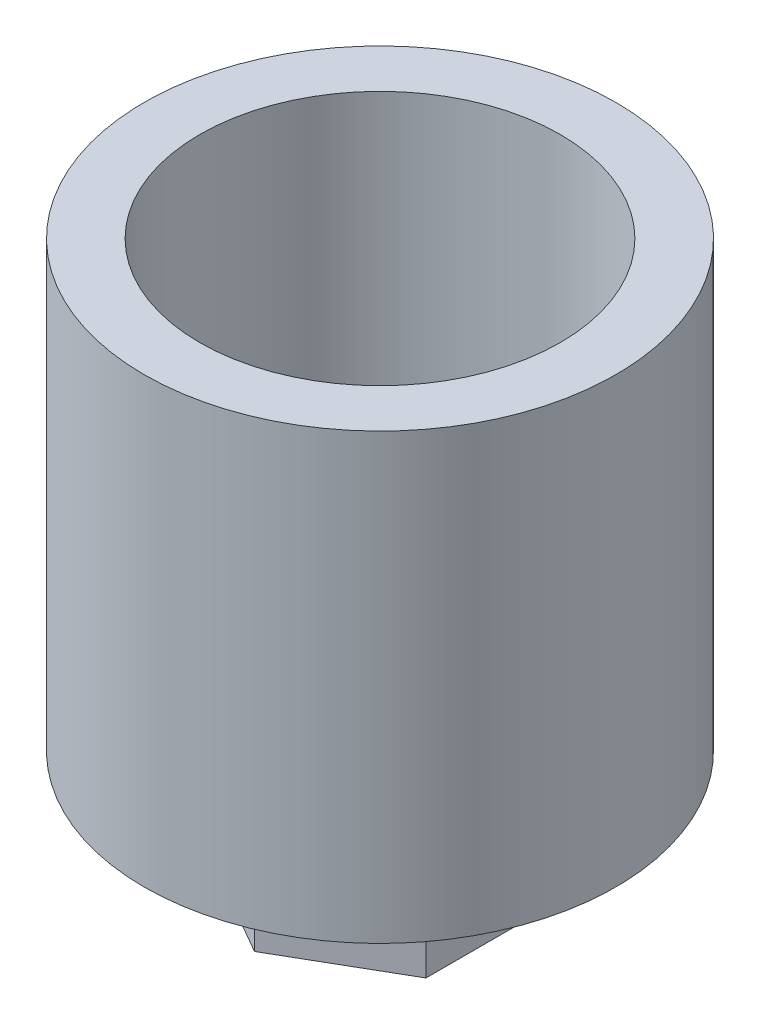
ISO-10303-21;
HEADER;
FILE_DESCRIPTION(('STEP AP214'),'2;1');
FILE_NAME('part.step','',(''),(''),'','','');
FILE_SCHEMA(('AUTOMOTIVE_DESIGN { 1 0 10303 214 1 1 1 1 }'));
ENDSEC;
DATA;
#1=APPLICATION_CONTEXT('core data for automotive mechanical design processes');
#2=APPLICATION_PROTOCOL_DEFINITION('international standard','automotive_design',2000,#1);
#3=PRODUCT_CONTEXT('',#1,'mechanical');
#4=PRODUCT('Part','Part','',(#3));
#5=PRODUCT_RELATED_PRODUCT_CATEGORY('part','',(#4));
#6=PRODUCT_DEFINITION_FORMATION('','',#4);
#7=PRODUCT_DEFINITION_CONTEXT('part definition',#1,'design');
#8=PRODUCT_DEFINITION('design','',#6,#7);
#9=PRODUCT_DEFINITION_SHAPE('','',#8);
#10=(LENGTH_UNIT() NAMED_UNIT(*) SI_UNIT(.MILLI.,.METRE.));
#11=(NAMED_UNIT(*) PLANE_ANGLE_UNIT() SI_UNIT($,.RADIAN.));
#12=(NAMED_UNIT(*) SI_UNIT($,.STERADIAN.) SOLID_ANGLE_UNIT());
#13=UNCERTAINTY_MEASURE_WITH_UNIT(LENGTH_MEASURE(1.E-05),#10,'distance_accuracy_value','');
#14=(GEOMETRIC_REPRESENTATION_CONTEXT(3) GLOBAL_UNCERTAINTY_ASSIGNED_CONTEXT((#13)) GLOBAL_UNIT_ASSIGNED_CONTEXT((#10,
#11,#12)) REPRESENTATION_CONTEXT('',''));
#15=CARTESIAN_POINT('',(0.,0.,0.));
#16=DIRECTION('',(0.,0.,1.));
#17=DIRECTION('',(1.,0.,0.));
#18=AXIS2_PLACEMENT_3D('',#15,#16,#17);
#19=CARTESIAN_POINT('',(0.,0.,0.));
#20=DIRECTION('',(0.,1.,0.));
#21=DIRECTION('',(0.,0.,1.));
#22=AXIS2_PLACEMENT_3D('',#19,#20,#21);
#23=PLANE('',#22);
#24=CARTESIAN_POINT('',(0.,0.,0.));
#25=DIRECTION('',(0.,1.,0.));
#26=DIRECTION('',(0.,0.,1.));
#27=AXIS2_PLACEMENT_3D('',#24,#25,#26);
#28=CIRCLE('',#27,13.5);
#29=CARTESIAN_POINT('',(0.,0.,13.5));
#30=VERTEX_POINT('',#29);
#31=EDGE_CURVE('E41',#30,#30,#28,.T.);
#32=ORIENTED_EDGE('',*,*,#31,.F.);
#33=EDGE_LOOP('',(#32));
#34=FACE_BOUND('',#33,.T.);
#35=DIRECTION('',(0.,0.,1.));
#36=VECTOR('',#35,1.);
#37=CARTESIAN_POINT('',(6.223,0.,-3.59285072516704));
#38=LINE('',#37,#36);
#39=CARTESIAN_POINT('',(6.223,0.,-3.59285072516704));
#40=VERTEX_POINT('',#39);
#41=CARTESIAN_POINT('',(6.223,0.,3.59285072516704));
#42=VERTEX_POINT('',#41);
#43=EDGE_CURVE('E52',#40,#42,#38,.T.);
#44=ORIENTED_EDGE('',*,*,#43,.F.);
#45=DIRECTION('',(0.866025403784439,0.,0.5));
#46=VECTOR('',#45,1.);
#47=CARTESIAN_POINT('',(0.,0.,-7.18570145033408));
#48=LINE('',#47,#46);
#49=CARTESIAN_POINT('',(0.,0.,-7.18570145033408));
#50=VERTEX_POINT('',#49);
#51=EDGE_CURVE('E56',#50,#40,#48,.T.);
#52=ORIENTED_EDGE('',*,*,#51,.F.);
#53=DIRECTION('',(0.866025403784439,0.,-0.5));
#54=VECTOR('',#53,1.);
#55=CARTESIAN_POINT('',(-6.223,0.,-3.59285072516704));
#56=LINE('',#55,#54);
#57=CARTESIAN_POINT('',(-6.223,0.,-3.59285072516704));
#58=VERTEX_POINT('',#57);
#59=EDGE_CURVE('E252',#58,#50,#56,.T.);
#60=ORIENTED_EDGE('',*,*,#59,.F.);
#61=DIRECTION('',(0.,0.,-1.));
#62=VECTOR('',#61,1.);
#63=CARTESIAN_POINT('',(-6.223,0.,3.59285072516704));
#64=LINE('',#63,#62);
#65=CARTESIAN_POINT('',(-6.223,0.,3.59285072516704));
#66=VERTEX_POINT('',#65);
#67=EDGE_CURVE('E267',#66,#58,#64,.T.);
#68=ORIENTED_EDGE('',*,*,#67,.F.);
#69=DIRECTION('',(-0.866025403784439,0.,-0.5));
#70=VECTOR('',#69,1.);
#71=CARTESIAN_POINT('',(0.,0.,7.18570145033408));
#72=LINE('',#71,#70);
#73=CARTESIAN_POINT('',(0.,0.,7.18570145033408));
#74=VERTEX_POINT('',#73);
#75=EDGE_CURVE('E270',#74,#66,#72,.T.);
#76=ORIENTED_EDGE('',*,*,#75,.F.);
#77=DIRECTION('',(-0.866025403784439,0.,0.5));
#78=VECTOR('',#77,1.);
#79=CARTESIAN_POINT('',(6.223,0.,3.59285072516704));
#80=LINE('',#79,#78);
#81=EDGE_CURVE('E271',#42,#74,#80,.T.);
#82=ORIENTED_EDGE('',*,*,#81,.F.);
#83=EDGE_LOOP('',(#44,#52,#60,#68,#76,#82));
#84=FACE_BOUND('',#83,.T.);
#85=ADVANCED_FACE('F37',(#34,#84),#23,.F.);
#86=CARTESIAN_POINT('',(0.,25.4,0.));
#87=DIRECTION('',(0.,-1.,0.));
#88=DIRECTION('',(0.,0.,-1.));
#89=AXIS2_PLACEMENT_3D('',#86,#87,#88);
#90=CYLINDRICAL_SURFACE('',#89,13.5);
#91=CARTESIAN_POINT('',(0.,25.4,0.));
#92=DIRECTION('',(0.,1.,0.));
#93=DIRECTION('',(0.,0.,1.));
#94=AXIS2_PLACEMENT_3D('',#91,#92,#93);
#95=CIRCLE('',#94,13.5);
#96=CARTESIAN_POINT('',(0.,25.4,13.5));
#97=VERTEX_POINT('',#96);
#98=EDGE_CURVE('E11',#97,#97,#95,.T.);
#99=ORIENTED_EDGE('',*,*,#98,.F.);
#100=EDGE_LOOP('',(#99));
#101=FACE_BOUND('',#100,.T.);
#102=ORIENTED_EDGE('',*,*,#31,.T.);
#103=EDGE_LOOP('',(#102));
#104=FACE_BOUND('',#103,.T.);
#105=ADVANCED_FACE('F39',(#101,#104),#90,.T.);
#106=CARTESIAN_POINT('',(0.,25.4,0.));
#107=DIRECTION('',(0.,1.,0.));
#108=DIRECTION('',(0.,0.,1.));
#109=AXIS2_PLACEMENT_3D('',#106,#107,#108);
#110=PLANE('',#109);
#111=CARTESIAN_POINT('',(0.,25.4,0.));
#112=DIRECTION('',(0.,1.,0.));
#113=DIRECTION('',(0.,0.,1.));
#114=AXIS2_PLACEMENT_3D('',#111,#112,#113);
#115=CIRCLE('',#114,10.31875);
#116=CARTESIAN_POINT('',(0.,25.4,10.31875));
#117=VERTEX_POINT('',#116);
#118=EDGE_CURVE('E113',#117,#117,#115,.T.);
#119=ORIENTED_EDGE('',*,*,#118,.F.);
#120=EDGE_LOOP('',(#119));
#121=FACE_BOUND('',#120,.T.);
#122=ORIENTED_EDGE('',*,*,#98,.T.);
#123=EDGE_LOOP('',(#122));
#124=FACE_BOUND('',#123,.T.);
#125=ADVANCED_FACE('F135',(#121,#124),#110,.T.);
#126=CARTESIAN_POINT('',(0.,6.35,0.));
#127=DIRECTION('',(0.,1.,0.));
#128=DIRECTION('',(0.,0.,1.));
#129=AXIS2_PLACEMENT_3D('',#126,#127,#128);
#130=CONICAL_SURFACE('',#129,10.31875,1.02974425867665);
#131=CARTESIAN_POINT('',(0.,0.14986948740936,0.));
#132=VERTEX_POINT('',#131);
#133=VERTEX_LOOP('',#132);
#134=FACE_BOUND('',#133,.T.);
#135=CARTESIAN_POINT('',(0.,6.35,0.));
#136=DIRECTION('',(0.,1.,0.));
#137=DIRECTION('',(0.,0.,1.));
#138=AXIS2_PLACEMENT_3D('',#135,#136,#137);
#139=CIRCLE('',#138,10.31875);
#140=CARTESIAN_POINT('',(0.,6.35,10.31875));
#141=VERTEX_POINT('',#140);
#142=EDGE_CURVE('E116',#141,#141,#139,.T.);
#143=ORIENTED_EDGE('',*,*,#142,.T.);
#144=EDGE_LOOP('',(#143));
#145=FACE_BOUND('',#144,.T.);
#146=ADVANCED_FACE('F140',(#134,#145),#130,.F.);
#147=CARTESIAN_POINT('',(0.,25.4,0.));
#148=DIRECTION('',(0.,1.,0.));
#149=DIRECTION('',(0.,0.,1.));
#150=AXIS2_PLACEMENT_3D('',#147,#148,#149);
#151=CYLINDRICAL_SURFACE('',#150,10.31875);
#152=ORIENTED_EDGE('',*,*,#142,.F.);
#153=EDGE_LOOP('',(#152));
#154=FACE_BOUND('',#153,.T.);
#155=ORIENTED_EDGE('',*,*,#118,.T.);
#156=EDGE_LOOP('',(#155));
#157=FACE_BOUND('',#156,.T.);
#158=ADVANCED_FACE('F144',(#154,#157),#151,.F.);
#159=CARTESIAN_POINT('',(6.223,-6.35,-3.59285072516704));
#160=DIRECTION('',(-1.,0.,0.));
#161=DIRECTION('',(0.,0.,1.));
#162=AXIS2_PLACEMENT_3D('',#159,#160,#161);
#163=PLANE('',#162);
#164=ORIENTED_EDGE('',*,*,#43,.T.);
#165=DIRECTION('',(0.,1.,0.));
#166=VECTOR('',#165,1.);
#167=CARTESIAN_POINT('',(6.223,-6.35,3.59285072516704));
#168=LINE('',#167,#166);
#169=CARTESIAN_POINT('',(6.223,-6.35,3.59285072516704));
#170=VERTEX_POINT('',#169);
#171=EDGE_CURVE('E96',#170,#42,#168,.T.);
#172=ORIENTED_EDGE('',*,*,#171,.F.);
#173=DIRECTION('',(0.,0.,1.));
#174=VECTOR('',#173,1.);
#175=CARTESIAN_POINT('',(6.223,-6.35,-3.59285072516704));
#176=LINE('',#175,#174);
#177=CARTESIAN_POINT('',(6.223,-6.35,-3.59285072516704));
#178=VERTEX_POINT('',#177);
#179=EDGE_CURVE('E102',#178,#170,#176,.T.);
#180=ORIENTED_EDGE('',*,*,#179,.F.);
#181=DIRECTION('',(0.,1.,0.));
#182=VECTOR('',#181,1.);
#183=CARTESIAN_POINT('',(6.223,-6.35,-3.59285072516704));
#184=LINE('',#183,#182);
#185=EDGE_CURVE('E249',#178,#40,#184,.T.);
#186=ORIENTED_EDGE('',*,*,#185,.T.);
#187=EDGE_LOOP('',(#164,#172,#180,#186));
#188=FACE_BOUND('',#187,.T.);
#189=ADVANCED_FACE('F112',(#188),#163,.F.);
#190=CARTESIAN_POINT('',(6.223,-6.35,3.59285072516704));
#191=DIRECTION('',(-0.5,0.,-0.866025403784439));
#192=DIRECTION('',(-0.866025403784439,0.,0.5));
#193=AXIS2_PLACEMENT_3D('',#190,#191,#192);
#194=PLANE('',#193);
#195=ORIENTED_EDGE('',*,*,#81,.T.);
#196=DIRECTION('',(0.,1.,0.));
#197=VECTOR('',#196,1.);
#198=CARTESIAN_POINT('',(0.,-6.35,7.18570145033408));
#199=LINE('',#198,#197);
#200=CARTESIAN_POINT('',(0.,-6.35,7.18570145033408));
#201=VERTEX_POINT('',#200);
#202=EDGE_CURVE('E98',#201,#74,#199,.T.);
#203=ORIENTED_EDGE('',*,*,#202,.F.);
#204=DIRECTION('',(-0.866025403784439,0.,0.5));
#205=VECTOR('',#204,1.);
#206=CARTESIAN_POINT('',(6.223,-6.35,3.59285072516704));
#207=LINE('',#206,#205);
#208=EDGE_CURVE('E91',#170,#201,#207,.T.);
#209=ORIENTED_EDGE('',*,*,#208,.F.);
#210=ORIENTED_EDGE('',*,*,#171,.T.);
#211=EDGE_LOOP('',(#195,#203,#209,#210));
#212=FACE_BOUND('',#211,.T.);
#213=ADVANCED_FACE('F94',(#212),#194,.F.);
#214=CARTESIAN_POINT('',(0.,-6.35,7.18570145033408));
#215=DIRECTION('',(0.5,0.,-0.866025403784439));
#216=DIRECTION('',(-0.866025403784439,0.,-0.5));
#217=AXIS2_PLACEMENT_3D('',#214,#215,#216);
#218=PLANE('',#217);
#219=ORIENTED_EDGE('',*,*,#75,.T.);
#220=DIRECTION('',(0.,1.,0.));
#221=VECTOR('',#220,1.);
#222=CARTESIAN_POINT('',(-6.223,-6.35,3.59285072516704));
#223=LINE('',#222,#221);
#224=CARTESIAN_POINT('',(-6.223,-6.35,3.59285072516704));
#225=VERTEX_POINT('',#224);
#226=EDGE_CURVE('E118',#225,#66,#223,.T.);
#227=ORIENTED_EDGE('',*,*,#226,.F.);
#228=DIRECTION('',(-0.866025403784439,0.,-0.5));
#229=VECTOR('',#228,1.);
#230=CARTESIAN_POINT('',(0.,-6.35,7.18570145033408));
#231=LINE('',#230,#229);
#232=EDGE_CURVE('E101',#201,#225,#231,.T.);
#233=ORIENTED_EDGE('',*,*,#232,.F.);
#234=ORIENTED_EDGE('',*,*,#202,.T.);
#235=EDGE_LOOP('',(#219,#227,#233,#234));
#236=FACE_BOUND('',#235,.T.);
#237=ADVANCED_FACE('F153',(#236),#218,.F.);
#238=CARTESIAN_POINT('',(-6.223,-6.35,3.59285072516704));
#239=DIRECTION('',(1.,0.,0.));
#240=DIRECTION('',(0.,0.,-1.));
#241=AXIS2_PLACEMENT_3D('',#238,#239,#240);
#242=PLANE('',#241);
#243=ORIENTED_EDGE('',*,*,#67,.T.);
#244=DIRECTION('',(0.,1.,0.));
#245=VECTOR('',#244,1.);
#246=CARTESIAN_POINT('',(-6.223,-6.35,-3.59285072516704));
#247=LINE('',#246,#245);
#248=CARTESIAN_POINT('',(-6.223,-6.35,-3.59285072516704));
#249=VERTEX_POINT('',#248);
#250=EDGE_CURVE('E255',#249,#58,#247,.T.);
#251=ORIENTED_EDGE('',*,*,#250,.F.);
#252=DIRECTION('',(0.,0.,-1.));
#253=VECTOR('',#252,1.);
#254=CARTESIAN_POINT('',(-6.223,-6.35,3.59285072516704));
#255=LINE('',#254,#253);
#256=EDGE_CURVE('E268',#225,#249,#255,.T.);
#257=ORIENTED_EDGE('',*,*,#256,.F.);
#258=ORIENTED_EDGE('',*,*,#226,.T.);
#259=EDGE_LOOP('',(#243,#251,#257,#258));
#260=FACE_BOUND('',#259,.T.);
#261=ADVANCED_FACE('F156',(#260),#242,.F.);
#262=CARTESIAN_POINT('',(-6.223,-6.35,-3.59285072516704));
#263=DIRECTION('',(0.5,0.,0.866025403784439));
#264=DIRECTION('',(0.866025403784439,0.,-0.5));
#265=AXIS2_PLACEMENT_3D('',#262,#263,#264);
#266=PLANE('',#265);
#267=ORIENTED_EDGE('',*,*,#59,.T.);
#268=DIRECTION('',(0.,1.,0.));
#269=VECTOR('',#268,1.);
#270=CARTESIAN_POINT('',(0.,-6.35,-7.18570145033408));
#271=LINE('',#270,#269);
#272=CARTESIAN_POINT('',(0.,-6.35,-7.18570145033408));
#273=VERTEX_POINT('',#272);
#274=EDGE_CURVE('E251',#273,#50,#271,.T.);
#275=ORIENTED_EDGE('',*,*,#274,.F.);
#276=DIRECTION('',(0.866025403784439,0.,-0.5));
#277=VECTOR('',#276,1.);
#278=CARTESIAN_POINT('',(-6.223,-6.35,-3.59285072516704));
#279=LINE('',#278,#277);
#280=EDGE_CURVE('E257',#249,#273,#279,.T.);
#281=ORIENTED_EDGE('',*,*,#280,.F.);
#282=ORIENTED_EDGE('',*,*,#250,.T.);
#283=EDGE_LOOP('',(#267,#275,#281,#282));
#284=FACE_BOUND('',#283,.T.);
#285=ADVANCED_FACE('F160',(#284),#266,.F.);
#286=CARTESIAN_POINT('',(0.,-6.35,-7.18570145033408));
#287=DIRECTION('',(-0.5,0.,0.866025403784439));
#288=DIRECTION('',(0.866025403784439,0.,0.5));
#289=AXIS2_PLACEMENT_3D('',#286,#287,#288);
#290=PLANE('',#289);
#291=ORIENTED_EDGE('',*,*,#51,.T.);
#292=ORIENTED_EDGE('',*,*,#185,.F.);
#293=DIRECTION('',(0.866025403784439,0.,0.5));
#294=VECTOR('',#293,1.);
#295=CARTESIAN_POINT('',(0.,-6.35,-7.18570145033408));
#296=LINE('',#295,#294);
#297=EDGE_CURVE('E107',#273,#178,#296,.T.);
#298=ORIENTED_EDGE('',*,*,#297,.F.);
#299=ORIENTED_EDGE('',*,*,#274,.T.);
#300=EDGE_LOOP('',(#291,#292,#298,#299));
#301=FACE_BOUND('',#300,.T.);
#302=ADVANCED_FACE('F164',(#301),#290,.F.);
#303=CARTESIAN_POINT('',(0.,-6.35,0.));
#304=DIRECTION('',(0.,-1.,0.));
#305=DIRECTION('',(0.,0.,-1.));
#306=AXIS2_PLACEMENT_3D('',#303,#304,#305);
#307=PLANE('',#306);
#308=ORIENTED_EDGE('',*,*,#179,.T.);
#309=ORIENTED_EDGE('',*,*,#208,.T.);
#310=ORIENTED_EDGE('',*,*,#232,.T.);
#311=ORIENTED_EDGE('',*,*,#256,.T.);
#312=ORIENTED_EDGE('',*,*,#280,.T.);
#313=ORIENTED_EDGE('',*,*,#297,.T.);
#314=EDGE_LOOP('',(#308,#309,#310,#311,#312,#313));
#315=FACE_BOUND('',#314,.T.);
#316=ADVANCED_FACE('F105',(#315),#307,.T.);
#317=CLOSED_SHELL('',(#85,#105,#125,#146,#158,#189,#213,#237,#261,#285,#302,#316));
#318=MANIFOLD_SOLID_BREP('B2',#317);
#319=ADVANCED_BREP_SHAPE_REPRESENTATION('',(#18,#318),#14);
#320=SHAPE_DEFINITION_REPRESENTATION(#9,#319);
ENDSEC;
END-ISO-10303-21;
